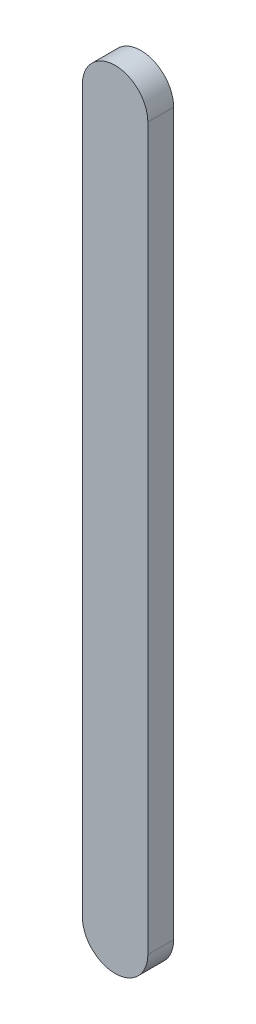
ISO-10303-21;
HEADER;
FILE_DESCRIPTION(('STEP AP214'),'2;1');
FILE_NAME('part.step','',(''),(''),'','','');
FILE_SCHEMA(('AUTOMOTIVE_DESIGN { 1 0 10303 214 1 1 1 1 }'));
ENDSEC;
DATA;
#1=APPLICATION_CONTEXT('core data for automotive mechanical design processes');
#2=APPLICATION_PROTOCOL_DEFINITION('international standard','automotive_design',2000,#1);
#3=PRODUCT_CONTEXT('',#1,'mechanical');
#4=PRODUCT('Part','Part','',(#3));
#5=PRODUCT_RELATED_PRODUCT_CATEGORY('part','',(#4));
#6=PRODUCT_DEFINITION_FORMATION('','',#4);
#7=PRODUCT_DEFINITION_CONTEXT('part definition',#1,'design');
#8=PRODUCT_DEFINITION('design','',#6,#7);
#9=PRODUCT_DEFINITION_SHAPE('','',#8);
#10=(LENGTH_UNIT() NAMED_UNIT(*) SI_UNIT(.MILLI.,.METRE.));
#11=(NAMED_UNIT(*) PLANE_ANGLE_UNIT() SI_UNIT($,.RADIAN.));
#12=(NAMED_UNIT(*) SI_UNIT($,.STERADIAN.) SOLID_ANGLE_UNIT());
#13=UNCERTAINTY_MEASURE_WITH_UNIT(LENGTH_MEASURE(1.E-05),#10,'distance_accuracy_value','');
#14=(GEOMETRIC_REPRESENTATION_CONTEXT(3) GLOBAL_UNCERTAINTY_ASSIGNED_CONTEXT((#13)) GLOBAL_UNIT_ASSIGNED_CONTEXT((#10,
#11,#12)) REPRESENTATION_CONTEXT('',''));
#15=CARTESIAN_POINT('',(0.,0.,0.));
#16=DIRECTION('',(0.,0.,1.));
#17=DIRECTION('',(1.,0.,0.));
#18=AXIS2_PLACEMENT_3D('',#15,#16,#17);
#19=CARTESIAN_POINT('',(111.7092,85.6712028,0.));
#20=DIRECTION('',(-1.,0.,0.));
#21=DIRECTION('',(0.,1.,0.));
#22=AXIS2_PLACEMENT_3D('',#19,#20,#21);
#23=PLANE('',#22);
#24=DIRECTION('',(0.,1.,0.));
#25=VECTOR('',#24,1.);
#26=CARTESIAN_POINT('',(111.7092,85.6712028,0.1999996));
#27=LINE('',#26,#25);
#28=CARTESIAN_POINT('',(111.7092,85.6712028,0.1999996));
#29=VERTEX_POINT('',#28);
#30=CARTESIAN_POINT('',(111.7092,91.2694644,0.1999996));
#31=VERTEX_POINT('',#30);
#32=EDGE_CURVE('E11',#29,#31,#27,.T.);
#33=ORIENTED_EDGE('',*,*,#32,.F.);
#34=DIRECTION('',(0.,0.,1.));
#35=VECTOR('',#34,1.);
#36=CARTESIAN_POINT('',(111.7092,85.6712028,0.));
#37=LINE('',#36,#35);
#38=CARTESIAN_POINT('',(111.7092,85.6712028,0.));
#39=VERTEX_POINT('',#38);
#40=EDGE_CURVE('E24',#39,#29,#37,.T.);
#41=ORIENTED_EDGE('',*,*,#40,.F.);
#42=DIRECTION('',(0.,1.,0.));
#43=VECTOR('',#42,1.);
#44=CARTESIAN_POINT('',(111.7092,85.6712028,0.));
#45=LINE('',#44,#43);
#46=CARTESIAN_POINT('',(111.7092,91.2694644,0.));
#47=VERTEX_POINT('',#46);
#48=EDGE_CURVE('E75',#39,#47,#45,.T.);
#49=ORIENTED_EDGE('',*,*,#48,.T.);
#50=DIRECTION('',(0.,0.,1.));
#51=VECTOR('',#50,1.);
#52=CARTESIAN_POINT('',(111.7092,91.2694644,0.));
#53=LINE('',#52,#51);
#54=EDGE_CURVE('E37',#47,#31,#53,.T.);
#55=ORIENTED_EDGE('',*,*,#54,.T.);
#56=EDGE_LOOP('',(#33,#41,#49,#55));
#57=FACE_BOUND('',#56,.T.);
#58=ADVANCED_FACE('F17',(#57),#23,.F.);
#59=CARTESIAN_POINT('',(111.4552,91.2694644,0.));
#60=DIRECTION('',(0.,0.,-1.));
#61=DIRECTION('',(1.,0.,0.));
#62=AXIS2_PLACEMENT_3D('',#59,#60,#61);
#63=CYLINDRICAL_SURFACE('',#62,0.253999999999995);
#64=CARTESIAN_POINT('',(111.4552,91.2694644,0.1999996));
#65=DIRECTION('',(0.,0.,1.));
#66=DIRECTION('',(1.,0.,0.));
#67=AXIS2_PLACEMENT_3D('',#64,#65,#66);
#68=CIRCLE('',#67,0.253999999999995);
#69=CARTESIAN_POINT('',(111.2012,91.2694644,0.1999996));
#70=VERTEX_POINT('',#69);
#71=EDGE_CURVE('E83',#31,#70,#68,.T.);
#72=ORIENTED_EDGE('',*,*,#71,.F.);
#73=ORIENTED_EDGE('',*,*,#54,.F.);
#74=CARTESIAN_POINT('',(111.4552,91.2694644,0.));
#75=DIRECTION('',(0.,0.,1.));
#76=DIRECTION('',(1.,0.,0.));
#77=AXIS2_PLACEMENT_3D('',#74,#75,#76);
#78=CIRCLE('',#77,0.253999999999995);
#79=CARTESIAN_POINT('',(111.2012,91.2694644,0.));
#80=VERTEX_POINT('',#79);
#81=EDGE_CURVE('E81',#47,#80,#78,.T.);
#82=ORIENTED_EDGE('',*,*,#81,.T.);
#83=DIRECTION('',(0.,0.,1.));
#84=VECTOR('',#83,1.);
#85=CARTESIAN_POINT('',(111.2012,91.2694644,0.));
#86=LINE('',#85,#84);
#87=EDGE_CURVE('E67',#80,#70,#86,.T.);
#88=ORIENTED_EDGE('',*,*,#87,.T.);
#89=EDGE_LOOP('',(#72,#73,#82,#88));
#90=FACE_BOUND('',#89,.T.);
#91=ADVANCED_FACE('F89',(#90),#63,.T.);
#92=CARTESIAN_POINT('',(111.2012,91.2694644,0.));
#93=DIRECTION('',(1.,0.,0.));
#94=DIRECTION('',(0.,-1.,0.));
#95=AXIS2_PLACEMENT_3D('',#92,#93,#94);
#96=PLANE('',#95);
#97=DIRECTION('',(0.,-1.,0.));
#98=VECTOR('',#97,1.);
#99=CARTESIAN_POINT('',(111.2012,91.2694644,0.1999996));
#100=LINE('',#99,#98);
#101=CARTESIAN_POINT('',(111.2012,85.6712028,0.1999996));
#102=VERTEX_POINT('',#101);
#103=EDGE_CURVE('E71',#70,#102,#100,.T.);
#104=ORIENTED_EDGE('',*,*,#103,.F.);
#105=ORIENTED_EDGE('',*,*,#87,.F.);
#106=DIRECTION('',(0.,-1.,0.));
#107=VECTOR('',#106,1.);
#108=CARTESIAN_POINT('',(111.2012,91.2694644,0.));
#109=LINE('',#108,#107);
#110=CARTESIAN_POINT('',(111.2012,85.6712028,0.));
#111=VERTEX_POINT('',#110);
#112=EDGE_CURVE('E63',#80,#111,#109,.T.);
#113=ORIENTED_EDGE('',*,*,#112,.T.);
#114=DIRECTION('',(0.,0.,1.));
#115=VECTOR('',#114,1.);
#116=CARTESIAN_POINT('',(111.2012,85.6712028,0.));
#117=LINE('',#116,#115);
#118=EDGE_CURVE('E53',#111,#102,#117,.T.);
#119=ORIENTED_EDGE('',*,*,#118,.T.);
#120=EDGE_LOOP('',(#104,#105,#113,#119));
#121=FACE_BOUND('',#120,.T.);
#122=ADVANCED_FACE('F66',(#121),#96,.F.);
#123=CARTESIAN_POINT('',(111.4552,85.6712028,0.));
#124=DIRECTION('',(0.,0.,-1.));
#125=DIRECTION('',(-1.,0.,0.));
#126=AXIS2_PLACEMENT_3D('',#123,#124,#125);
#127=CYLINDRICAL_SURFACE('',#126,0.253999999999995);
#128=CARTESIAN_POINT('',(111.4552,85.6712028,0.1999996));
#129=DIRECTION('',(0.,0.,1.));
#130=DIRECTION('',(-1.,0.,0.));
#131=AXIS2_PLACEMENT_3D('',#128,#129,#130);
#132=CIRCLE('',#131,0.253999999999995);
#133=EDGE_CURVE('E59',#102,#29,#132,.T.);
#134=ORIENTED_EDGE('',*,*,#133,.F.);
#135=ORIENTED_EDGE('',*,*,#118,.F.);
#136=CARTESIAN_POINT('',(111.4552,85.6712028,0.));
#137=DIRECTION('',(0.,0.,1.));
#138=DIRECTION('',(-1.,0.,0.));
#139=AXIS2_PLACEMENT_3D('',#136,#137,#138);
#140=CIRCLE('',#139,0.253999999999995);
#141=EDGE_CURVE('E57',#111,#39,#140,.T.);
#142=ORIENTED_EDGE('',*,*,#141,.T.);
#143=ORIENTED_EDGE('',*,*,#40,.T.);
#144=EDGE_LOOP('',(#134,#135,#142,#143));
#145=FACE_BOUND('',#144,.T.);
#146=ADVANCED_FACE('F55',(#145),#127,.T.);
#147=CARTESIAN_POINT('',(111.7092,85.6712028,0.));
#148=DIRECTION('',(0.,0.,-1.));
#149=DIRECTION('',(-1.,0.,0.));
#150=AXIS2_PLACEMENT_3D('',#147,#148,#149);
#151=PLANE('',#150);
#152=ORIENTED_EDGE('',*,*,#141,.F.);
#153=ORIENTED_EDGE('',*,*,#112,.F.);
#154=ORIENTED_EDGE('',*,*,#81,.F.);
#155=ORIENTED_EDGE('',*,*,#48,.F.);
#156=EDGE_LOOP('',(#152,#153,#154,#155));
#157=FACE_BOUND('',#156,.T.);
#158=ADVANCED_FACE('F74',(#157),#151,.T.);
#159=CARTESIAN_POINT('',(111.7092,85.6712028,0.1999996));
#160=DIRECTION('',(0.,0.,-1.));
#161=DIRECTION('',(-1.,0.,0.));
#162=AXIS2_PLACEMENT_3D('',#159,#160,#161);
#163=PLANE('',#162);
#164=ORIENTED_EDGE('',*,*,#32,.T.);
#165=ORIENTED_EDGE('',*,*,#71,.T.);
#166=ORIENTED_EDGE('',*,*,#103,.T.);
#167=ORIENTED_EDGE('',*,*,#133,.T.);
#168=EDGE_LOOP('',(#164,#165,#166,#167));
#169=FACE_BOUND('',#168,.T.);
#170=ADVANCED_FACE('F91',(#169),#163,.F.);
#171=CLOSED_SHELL('',(#58,#91,#122,#146,#158,#170));
#172=MANIFOLD_SOLID_BREP('B1',#171);
#173=ADVANCED_BREP_SHAPE_REPRESENTATION('',(#18,#172),#14);
#174=SHAPE_DEFINITION_REPRESENTATION(#9,#173);
ENDSEC;
END-ISO-10303-21;
